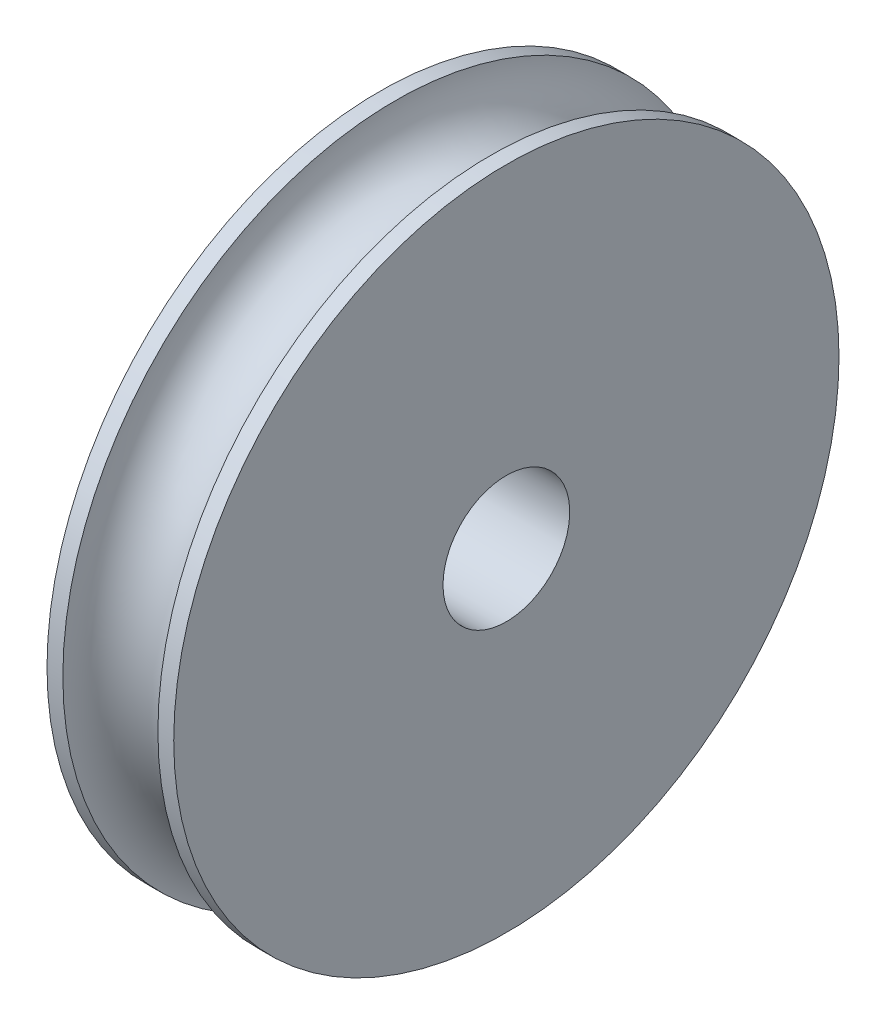
ISO-10303-21;
HEADER;
FILE_DESCRIPTION(('STEP AP214'),'2;1');
FILE_NAME('part.step','',(''),(''),'','','');
FILE_SCHEMA(('AUTOMOTIVE_DESIGN { 1 0 10303 214 1 1 1 1 }'));
ENDSEC;
DATA;
#1=APPLICATION_CONTEXT('core data for automotive mechanical design processes');
#2=APPLICATION_PROTOCOL_DEFINITION('international standard','automotive_design',2000,#1);
#3=PRODUCT_CONTEXT('',#1,'mechanical');
#4=PRODUCT('Part','Part','',(#3));
#5=PRODUCT_RELATED_PRODUCT_CATEGORY('part','',(#4));
#6=PRODUCT_DEFINITION_FORMATION('','',#4);
#7=PRODUCT_DEFINITION_CONTEXT('part definition',#1,'design');
#8=PRODUCT_DEFINITION('design','',#6,#7);
#9=PRODUCT_DEFINITION_SHAPE('','',#8);
#10=(LENGTH_UNIT() NAMED_UNIT(*) SI_UNIT(.MILLI.,.METRE.));
#11=(NAMED_UNIT(*) PLANE_ANGLE_UNIT() SI_UNIT($,.RADIAN.));
#12=(NAMED_UNIT(*) SI_UNIT($,.STERADIAN.) SOLID_ANGLE_UNIT());
#13=UNCERTAINTY_MEASURE_WITH_UNIT(LENGTH_MEASURE(1.E-05),#10,'distance_accuracy_value','');
#14=(GEOMETRIC_REPRESENTATION_CONTEXT(3) GLOBAL_UNCERTAINTY_ASSIGNED_CONTEXT((#13)) GLOBAL_UNIT_ASSIGNED_CONTEXT((#10,
#11,#12)) REPRESENTATION_CONTEXT('',''));
#15=CARTESIAN_POINT('',(0.,0.,0.));
#16=DIRECTION('',(0.,0.,1.));
#17=DIRECTION('',(1.,0.,0.));
#18=AXIS2_PLACEMENT_3D('',#15,#16,#17);
#19=CARTESIAN_POINT('',(0.,0.,5.25));
#20=DIRECTION('',(-1.,0.,0.));
#21=DIRECTION('',(0.,0.,1.));
#22=AXIS2_PLACEMENT_3D('',#19,#20,#21);
#23=PLANE('',#22);
#24=CARTESIAN_POINT('',(0.,0.,0.));
#25=DIRECTION('',(-1.,0.,0.));
#26=DIRECTION('',(0.,0.,1.));
#27=AXIS2_PLACEMENT_3D('',#24,#25,#26);
#28=CIRCLE('',#27,5.25);
#29=CARTESIAN_POINT('',(0.,0.,5.25));
#30=VERTEX_POINT('',#29);
#31=EDGE_CURVE('E58',#30,#30,#28,.T.);
#32=ORIENTED_EDGE('',*,*,#31,.T.);
#33=EDGE_LOOP('',(#32));
#34=FACE_BOUND('',#33,.T.);
#35=CARTESIAN_POINT('',(0.,0.,0.));
#36=DIRECTION('',(-1.,0.,0.));
#37=DIRECTION('',(0.,0.,1.));
#38=AXIS2_PLACEMENT_3D('',#35,#36,#37);
#39=CIRCLE('',#38,1.);
#40=CARTESIAN_POINT('',(0.,0.,1.));
#41=VERTEX_POINT('',#40);
#42=EDGE_CURVE('E10',#41,#41,#39,.T.);
#43=ORIENTED_EDGE('',*,*,#42,.F.);
#44=EDGE_LOOP('',(#43));
#45=FACE_BOUND('',#44,.T.);
#46=ADVANCED_FACE('F36',(#34,#45),#23,.T.);
#47=CARTESIAN_POINT('',(0.,0.,0.));
#48=DIRECTION('',(-1.,0.,0.));
#49=DIRECTION('',(0.,0.,1.));
#50=AXIS2_PLACEMENT_3D('',#47,#48,#49);
#51=CYLINDRICAL_SURFACE('',#50,1.);
#52=ORIENTED_EDGE('',*,*,#42,.T.);
#53=EDGE_LOOP('',(#52));
#54=FACE_BOUND('',#53,.T.);
#55=CARTESIAN_POINT('',(2.,0.,0.));
#56=DIRECTION('',(-1.,0.,0.));
#57=DIRECTION('',(0.,0.,1.));
#58=AXIS2_PLACEMENT_3D('',#55,#56,#57);
#59=CIRCLE('',#58,1.);
#60=CARTESIAN_POINT('',(2.,0.,1.));
#61=VERTEX_POINT('',#60);
#62=EDGE_CURVE('E42',#61,#61,#59,.T.);
#63=ORIENTED_EDGE('',*,*,#62,.F.);
#64=EDGE_LOOP('',(#63));
#65=FACE_BOUND('',#64,.T.);
#66=ADVANCED_FACE('F76',(#54,#65),#51,.F.);
#67=CARTESIAN_POINT('',(2.,0.,1.));
#68=DIRECTION('',(1.,0.,0.));
#69=DIRECTION('',(0.,0.,-1.));
#70=AXIS2_PLACEMENT_3D('',#67,#68,#69);
#71=PLANE('',#70);
#72=ORIENTED_EDGE('',*,*,#62,.T.);
#73=EDGE_LOOP('',(#72));
#74=FACE_BOUND('',#73,.T.);
#75=CARTESIAN_POINT('',(2.,0.,0.));
#76=DIRECTION('',(-1.,0.,0.));
#77=DIRECTION('',(0.,0.,1.));
#78=AXIS2_PLACEMENT_3D('',#75,#76,#77);
#79=CIRCLE('',#78,5.25);
#80=CARTESIAN_POINT('',(2.,0.,5.25));
#81=VERTEX_POINT('',#80);
#82=EDGE_CURVE('E46',#81,#81,#79,.T.);
#83=ORIENTED_EDGE('',*,*,#82,.F.);
#84=EDGE_LOOP('',(#83));
#85=FACE_BOUND('',#84,.T.);
#86=ADVANCED_FACE('F80',(#74,#85),#71,.T.);
#87=CARTESIAN_POINT('',(0.,0.,0.));
#88=DIRECTION('',(-1.,0.,0.));
#89=DIRECTION('',(0.,0.,1.));
#90=AXIS2_PLACEMENT_3D('',#87,#88,#89);
#91=CYLINDRICAL_SURFACE('',#90,5.25);
#92=ORIENTED_EDGE('',*,*,#82,.T.);
#93=EDGE_LOOP('',(#92));
#94=FACE_BOUND('',#93,.T.);
#95=CARTESIAN_POINT('',(1.75,0.,0.));
#96=DIRECTION('',(-1.,0.,0.));
#97=DIRECTION('',(0.,0.,1.));
#98=AXIS2_PLACEMENT_3D('',#95,#96,#97);
#99=CIRCLE('',#98,5.25);
#100=CARTESIAN_POINT('',(1.75,0.,5.25));
#101=VERTEX_POINT('',#100);
#102=EDGE_CURVE('E50',#101,#101,#99,.T.);
#103=ORIENTED_EDGE('',*,*,#102,.F.);
#104=EDGE_LOOP('',(#103));
#105=FACE_BOUND('',#104,.T.);
#106=ADVANCED_FACE('F72',(#94,#105),#91,.T.);
#107=CARTESIAN_POINT('',(1.,0.,0.));
#108=DIRECTION('',(-1.,0.,0.));
#109=DIRECTION('',(0.,0.,1.));
#110=AXIS2_PLACEMENT_3D('',#107,#108,#109);
#111=TOROIDAL_SURFACE('',#110,5.25,0.75);
#112=ORIENTED_EDGE('',*,*,#102,.T.);
#113=EDGE_LOOP('',(#112));
#114=FACE_BOUND('',#113,.T.);
#115=CARTESIAN_POINT('',(0.25,0.,0.));
#116=DIRECTION('',(-1.,0.,0.));
#117=DIRECTION('',(0.,0.,1.));
#118=AXIS2_PLACEMENT_3D('',#115,#116,#117);
#119=CIRCLE('',#118,5.25);
#120=CARTESIAN_POINT('',(0.25,0.,5.25));
#121=VERTEX_POINT('',#120);
#122=EDGE_CURVE('E55',#121,#121,#119,.T.);
#123=ORIENTED_EDGE('',*,*,#122,.F.);
#124=EDGE_LOOP('',(#123));
#125=FACE_BOUND('',#124,.T.);
#126=ADVANCED_FACE('F66',(#114,#125),#111,.F.);
#127=CARTESIAN_POINT('',(0.,0.,0.));
#128=DIRECTION('',(-1.,0.,0.));
#129=DIRECTION('',(0.,0.,1.));
#130=AXIS2_PLACEMENT_3D('',#127,#128,#129);
#131=CYLINDRICAL_SURFACE('',#130,5.25);
#132=ORIENTED_EDGE('',*,*,#122,.T.);
#133=EDGE_LOOP('',(#132));
#134=FACE_BOUND('',#133,.T.);
#135=ORIENTED_EDGE('',*,*,#31,.F.);
#136=EDGE_LOOP('',(#135));
#137=FACE_BOUND('',#136,.T.);
#138=ADVANCED_FACE('F64',(#134,#137),#131,.T.);
#139=CLOSED_SHELL('',(#46,#66,#86,#106,#126,#138));
#140=MANIFOLD_SOLID_BREP('B2',#139);
#141=ADVANCED_BREP_SHAPE_REPRESENTATION('',(#18,#140),#14);
#142=SHAPE_DEFINITION_REPRESENTATION(#9,#141);
ENDSEC;
END-ISO-10303-21;
